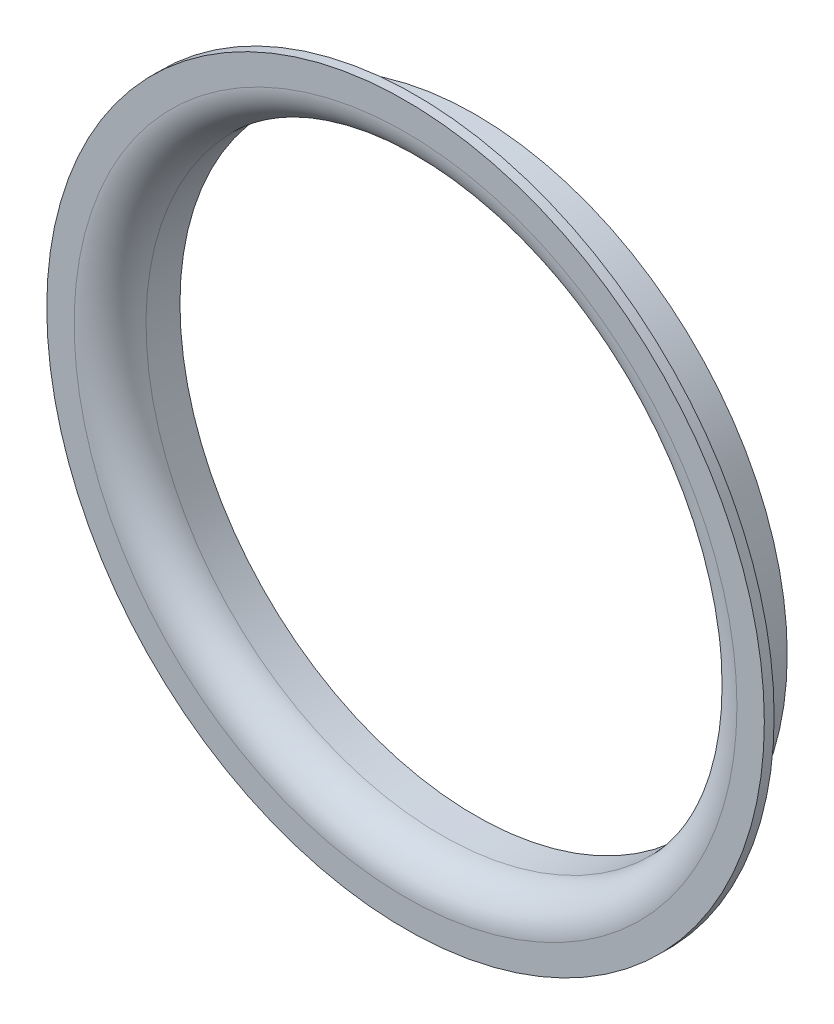
ISO-10303-21;
HEADER;
FILE_DESCRIPTION(('STEP AP214'),'2;1');
FILE_NAME('part.step','',(''),(''),'','','');
FILE_SCHEMA(('AUTOMOTIVE_DESIGN { 1 0 10303 214 1 1 1 1 }'));
ENDSEC;
DATA;
#1=APPLICATION_CONTEXT('core data for automotive mechanical design processes');
#2=APPLICATION_PROTOCOL_DEFINITION('international standard','automotive_design',2000,#1);
#3=PRODUCT_CONTEXT('',#1,'mechanical');
#4=PRODUCT('Part','Part','',(#3));
#5=PRODUCT_RELATED_PRODUCT_CATEGORY('part','',(#4));
#6=PRODUCT_DEFINITION_FORMATION('','',#4);
#7=PRODUCT_DEFINITION_CONTEXT('part definition',#1,'design');
#8=PRODUCT_DEFINITION('design','',#6,#7);
#9=PRODUCT_DEFINITION_SHAPE('','',#8);
#10=(LENGTH_UNIT() NAMED_UNIT(*) SI_UNIT(.MILLI.,.METRE.));
#11=(NAMED_UNIT(*) PLANE_ANGLE_UNIT() SI_UNIT($,.RADIAN.));
#12=(NAMED_UNIT(*) SI_UNIT($,.STERADIAN.) SOLID_ANGLE_UNIT());
#13=UNCERTAINTY_MEASURE_WITH_UNIT(LENGTH_MEASURE(1.E-05),#10,'distance_accuracy_value','');
#14=(GEOMETRIC_REPRESENTATION_CONTEXT(3) GLOBAL_UNCERTAINTY_ASSIGNED_CONTEXT((#13)) GLOBAL_UNIT_ASSIGNED_CONTEXT((#10,
#11,#12)) REPRESENTATION_CONTEXT('',''));
#15=CARTESIAN_POINT('',(0.,0.,0.));
#16=DIRECTION('',(0.,0.,1.));
#17=DIRECTION('',(1.,0.,0.));
#18=AXIS2_PLACEMENT_3D('',#15,#16,#17);
#19=CARTESIAN_POINT('',(0.,0.,6.02878527214585));
#20=DIRECTION('',(0.,0.,-1.));
#21=DIRECTION('',(-1.,0.,0.));
#22=AXIS2_PLACEMENT_3D('',#19,#20,#21);
#23=TOROIDAL_SURFACE('',#22,38.7931937172775,2.29319371727749);
#24=CARTESIAN_POINT('',(0.,0.,8.32197898942334));
#25=DIRECTION('',(0.,0.,-1.));
#26=DIRECTION('',(1.,0.,0.));
#27=AXIS2_PLACEMENT_3D('',#24,#25,#26);
#28=CIRCLE('',#27,38.7931937172775);
#29=CARTESIAN_POINT('',(-38.7931937172775,0.,8.32197898942334));
#30=VERTEX_POINT('',#29);
#31=EDGE_CURVE('E12',#30,#30,#28,.T.);
#32=ORIENTED_EDGE('',*,*,#31,.T.);
#33=EDGE_LOOP('',(#32));
#34=FACE_BOUND('',#33,.T.);
#35=CARTESIAN_POINT('',(0.,0.,6.02878527214585));
#36=DIRECTION('',(0.,0.,1.));
#37=DIRECTION('',(1.,0.,0.));
#38=AXIS2_PLACEMENT_3D('',#35,#36,#37);
#39=CIRCLE('',#38,36.5);
#40=CARTESIAN_POINT('',(-36.5,0.,6.02878527214585));
#41=VERTEX_POINT('',#40);
#42=EDGE_CURVE('E54',#41,#41,#39,.T.);
#43=ORIENTED_EDGE('',*,*,#42,.T.);
#44=EDGE_LOOP('',(#43));
#45=FACE_BOUND('',#44,.T.);
#46=ADVANCED_FACE('F43',(#34,#45),#23,.F.);
#47=CARTESIAN_POINT('',(0.,0.,1.28951825643905));
#48=DIRECTION('',(0.,0.,-1.));
#49=DIRECTION('',(1.,0.,0.));
#50=AXIS2_PLACEMENT_3D('',#47,#48,#49);
#51=CYLINDRICAL_SURFACE('',#50,36.5);
#52=CARTESIAN_POINT('',(0.,0.,1.28951825643905));
#53=DIRECTION('',(0.,0.,-1.));
#54=DIRECTION('',(1.,0.,0.));
#55=AXIS2_PLACEMENT_3D('',#52,#53,#54);
#56=CIRCLE('',#55,36.5);
#57=CARTESIAN_POINT('',(-36.5,0.,1.28951825643905));
#58=VERTEX_POINT('',#57);
#59=EDGE_CURVE('E70',#58,#58,#56,.T.);
#60=ORIENTED_EDGE('',*,*,#59,.F.);
#61=EDGE_LOOP('',(#60));
#62=FACE_BOUND('',#61,.T.);
#63=ORIENTED_EDGE('',*,*,#42,.F.);
#64=EDGE_LOOP('',(#63));
#65=FACE_BOUND('',#64,.T.);
#66=ADVANCED_FACE('F71',(#62,#65),#51,.T.);
#67=CARTESIAN_POINT('',(0.,0.,8.32197898942334));
#68=DIRECTION('',(0.,0.,1.));
#69=DIRECTION('',(1.,0.,0.));
#70=AXIS2_PLACEMENT_3D('',#67,#68,#69);
#71=PLANE('',#70);
#72=ORIENTED_EDGE('',*,*,#31,.F.);
#73=EDGE_LOOP('',(#72));
#74=FACE_BOUND('',#73,.T.);
#75=CARTESIAN_POINT('',(0.,0.,8.32197898942334));
#76=DIRECTION('',(0.,0.,1.));
#77=DIRECTION('',(1.,0.,0.));
#78=AXIS2_PLACEMENT_3D('',#75,#76,#77);
#79=CIRCLE('',#78,42.);
#80=CARTESIAN_POINT('',(42.,0.,8.32197898942334));
#81=VERTEX_POINT('',#80);
#82=EDGE_CURVE('E81',#81,#81,#79,.F.);
#83=ORIENTED_EDGE('',*,*,#82,.T.);
#84=EDGE_LOOP('',(#83));
#85=FACE_BOUND('',#84,.T.);
#86=ADVANCED_FACE('F45',(#74,#85),#71,.F.);
#87=CARTESIAN_POINT('',(0.,0.,5.26438736638669));
#88=DIRECTION('',(0.,0.,-1.));
#89=DIRECTION('',(-1.,0.,0.));
#90=AXIS2_PLACEMENT_3D('',#87,#88,#89);
#91=TOROIDAL_SURFACE('',#90,38.7931937172775,4.20418848167539);
#92=CARTESIAN_POINT('',(34.5890052356021,0.,5.26438736638669));
#93=CARTESIAN_POINT('',(34.5890172410576,-0.565961846233352,5.26438736638669));
#94=CARTESIAN_POINT('',(34.5751148834415,-1.13192267092011,5.26438736638669));
#95=CARTESIAN_POINT('',(34.5195676445111,-2.26248141749966,5.26438736638669));
#96=CARTESIAN_POINT('',(34.4779227631968,-2.82707933939246,5.26438736638669));
#97=CARTESIAN_POINT('',(34.3669766793149,-3.95355142068337,5.26438736638669));
#98=CARTESIAN_POINT('',(34.2976754767473,-4.51542558008149,5.26438736638669));
#99=CARTESIAN_POINT('',(34.1315874874656,-5.63509671823628,5.26438736638669));
#100=CARTESIAN_POINT('',(34.0348007007515,-6.19289369699296,5.26438736638669));
#101=CARTESIAN_POINT('',(33.8139736969861,-7.30306664226934,5.26438736638669));
#102=CARTESIAN_POINT('',(33.6899334799347,-7.85544260878905,5.26438736638669));
#103=CARTESIAN_POINT('',(33.4148987109528,-8.95344282085401,5.26438736638669));
#104=CARTESIAN_POINT('',(33.2639041590222,-9.49906706639925,5.26438736638669));
#105=CARTESIAN_POINT('',(32.9353244065783,-10.5822493763401,5.26438736638669));
#106=CARTESIAN_POINT('',(32.757739206065,-11.1198074407356,5.26438736638669));
#107=CARTESIAN_POINT('',(32.3764059942662,-12.1855623648738,5.26438736638669));
#108=CARTESIAN_POINT('',(32.1726579829808,-12.7137592246164,5.26438736638669));
#109=CARTESIAN_POINT('',(31.7394899912162,-13.7595192666921,5.26438736638669));
#110=CARTESIAN_POINT('',(31.510070010737,-14.2770824490253,5.26438736638669));
#111=CARTESIAN_POINT('',(31.0261107748131,-15.3003282813115,5.26438736638669));
#112=CARTESIAN_POINT('',(30.7715715193684,-15.8060109312645,5.26438736638669));
#113=CARTESIAN_POINT('',(30.2379869404997,-16.8042774649758,5.26438736638669));
#114=CARTESIAN_POINT('',(29.9589416170757,-17.2968613487341,5.26438736638669));
#115=CARTESIAN_POINT('',(29.3770171469745,-18.2677436723394,5.26438736638669));
#116=CARTESIAN_POINT('',(29.0741380002973,-18.7460421121866,5.26438736638669));
#117=CARTESIAN_POINT('',(28.4452755460562,-19.6872012851328,5.26438736638669));
#118=CARTESIAN_POINT('',(28.1192922384924,-20.1500620182319,5.26438736638669));
#119=CARTESIAN_POINT('',(27.4450067848258,-21.0592307056347,5.26438736638669));
#120=CARTESIAN_POINT('',(27.0967046387231,-21.5055386599383,5.26438736638669));
#121=CARTESIAN_POINT('',(26.3786205983546,-22.380526594796,5.26438736638669));
#122=CARTESIAN_POINT('',(26.0088387040888,-22.8092065753501,5.26438736638669));
#123=CARTESIAN_POINT('',(25.2486860043671,-23.6479058350879,5.26438736638669));
#124=CARTESIAN_POINT('',(24.858315198911,-24.0579251142714,5.26438736638669));
#125=CARTESIAN_POINT('',(24.0579251142714,-24.858315198911,5.26438736638669));
#126=CARTESIAN_POINT('',(23.6479058350879,-25.2486860043671,5.26438736638669));
#127=CARTESIAN_POINT('',(22.8092065753501,-26.0088387040888,5.26438736638669));
#128=CARTESIAN_POINT('',(22.380526594796,-26.3786205983545,5.26438736638669));
#129=CARTESIAN_POINT('',(21.5055386599383,-27.0967046387232,5.26438736638669));
#130=CARTESIAN_POINT('',(21.0592307056347,-27.4450067848262,5.26438736638669));
#131=CARTESIAN_POINT('',(20.1500620182319,-28.1192922384919,5.26438736638669));
#132=CARTESIAN_POINT('',(19.6872012851328,-28.4452755460546,5.26438736638669));
#133=CARTESIAN_POINT('',(18.7460421121867,-29.074138000299,5.26438736638669));
#134=CARTESIAN_POINT('',(18.2677436723397,-29.3770171469807,5.26438736638669));
#135=CARTESIAN_POINT('',(17.2968613487338,-29.9589416170696,5.26438736638669));
#136=CARTESIAN_POINT('',(16.8042774649747,-30.2379869404768,5.26438736638669));
#137=CARTESIAN_POINT('',(15.8060109312657,-30.7715715193913,5.26438736638669));
#138=CARTESIAN_POINT('',(15.3003282813157,-31.0261107748985,5.26438736638669));
#139=CARTESIAN_POINT('',(14.2770824490211,-31.5100700106515,5.26438736638669));
#140=CARTESIAN_POINT('',(13.7595192666765,-31.7394899908972,5.26438736638669));
#141=CARTESIAN_POINT('',(12.7137592246321,-32.1726579832998,5.26438736638669));
#142=CARTESIAN_POINT('',(12.1855623649323,-32.3764059954568,5.26438736638669));
#143=CARTESIAN_POINT('',(11.1198074406772,-32.7577392048744,5.26438736638669));
#144=CARTESIAN_POINT('',(10.5822493761218,-32.9353244021351,5.26438736638669));
#145=CARTESIAN_POINT('',(9.49906706661754,-33.2639041634653,5.26438736638669));
#146=CARTESIAN_POINT('',(8.95344282166865,-33.4148987275349,5.26438736638669));
#147=CARTESIAN_POINT('',(7.85544260797443,-33.6899334633526,5.26438736638669));
#148=CARTESIAN_POINT('',(7.30306663922911,-33.8139736351007,5.26438736638669));
#149=CARTESIAN_POINT('',(6.19289370003319,-34.034800762637,5.26438736638669));
#150=CARTESIAN_POINT('',(5.63509672958259,-34.1315877184252,5.26438736638669));
#151=CARTESIAN_POINT('',(4.51542556873516,-34.2976752457877,5.26438736638669));
#152=CARTESIAN_POINT('',(3.95355137833834,-34.366975817362,5.26438736638669));
#153=CARTESIAN_POINT('',(2.82707938173749,-34.4779236251497,5.26438736638669));
#154=CARTESIAN_POINT('',(2.26248157553346,-34.5195708613632,5.26438736638669));
#155=CARTESIAN_POINT('',(1.1319225128863,-34.5751116665894,5.26438736638669));
#156=CARTESIAN_POINT('',(0.565961256443151,-34.5890052356021,5.26438736638669));
#157=CARTESIAN_POINT('',(-0.56596125644314,-34.5890052356021,5.26438736638669));
#158=CARTESIAN_POINT('',(-1.13192251288629,-34.5751116665894,5.26438736638669));
#159=CARTESIAN_POINT('',(-2.26248157553345,-34.5195708613632,5.26438736638669));
#160=CARTESIAN_POINT('',(-2.82707938173748,-34.4779236251497,5.26438736638669));
#161=CARTESIAN_POINT('',(-3.95355137833832,-34.366975817362,5.26438736638669));
#162=CARTESIAN_POINT('',(-4.51542556873515,-34.2976752457877,5.26438736638669));
#163=CARTESIAN_POINT('',(-5.63509672958258,-34.1315877184252,5.26438736638669));
#164=CARTESIAN_POINT('',(-6.19289370003318,-34.034800762637,5.26438736638669));
#165=CARTESIAN_POINT('',(-7.3030666392291,-33.8139736351007,5.26438736638669));
#166=CARTESIAN_POINT('',(-7.85544260797442,-33.6899334633526,5.26438736638669));
#167=CARTESIAN_POINT('',(-8.95344282166863,-33.4148987275349,5.26438736638669));
#168=CARTESIAN_POINT('',(-9.49906706661753,-33.2639041634653,5.26438736638669));
#169=CARTESIAN_POINT('',(-10.5822493761218,-32.9353244021351,5.26438736638669));
#170=CARTESIAN_POINT('',(-11.1198074406772,-32.7577392048744,5.26438736638669));
#171=CARTESIAN_POINT('',(-12.1855623649323,-32.3764059954568,5.26438736638669));
#172=CARTESIAN_POINT('',(-12.7137592246321,-32.1726579832998,5.26438736638669));
#173=CARTESIAN_POINT('',(-13.7595192666765,-31.7394899908972,5.26438736638669));
#174=CARTESIAN_POINT('',(-14.2770824490211,-31.5100700106515,5.26438736638669));
#175=CARTESIAN_POINT('',(-15.3003282813157,-31.0261107748986,5.26438736638669));
#176=CARTESIAN_POINT('',(-15.8060109312657,-30.7715715193913,5.26438736638669));
#177=CARTESIAN_POINT('',(-16.8042774649747,-30.2379869404768,5.26438736638669));
#178=CARTESIAN_POINT('',(-17.2968613487338,-29.9589416170696,5.26438736638669));
#179=CARTESIAN_POINT('',(-18.2677436723397,-29.3770171469807,5.26438736638669));
#180=CARTESIAN_POINT('',(-18.7460421121866,-29.074138000299,5.26438736638669));
#181=CARTESIAN_POINT('',(-19.6872012851327,-28.4452755460546,5.26438736638669));
#182=CARTESIAN_POINT('',(-20.1500620182319,-28.1192922384919,5.26438736638669));
#183=CARTESIAN_POINT('',(-21.0592307056347,-27.4450067848262,5.26438736638669));
#184=CARTESIAN_POINT('',(-21.5055386599383,-27.0967046387232,5.26438736638669));
#185=CARTESIAN_POINT('',(-22.380526594796,-26.3786205983545,5.26438736638669));
#186=CARTESIAN_POINT('',(-22.8092065753501,-26.0088387040888,5.26438736638669));
#187=CARTESIAN_POINT('',(-23.6479058350878,-25.2486860043671,5.26438736638669));
#188=CARTESIAN_POINT('',(-24.0579251142714,-24.8583151989111,5.26438736638669));
#189=CARTESIAN_POINT('',(-24.858315198911,-24.0579251142714,5.26438736638669));
#190=CARTESIAN_POINT('',(-25.2486860043671,-23.6479058350878,5.26438736638669));
#191=CARTESIAN_POINT('',(-26.0088387040888,-22.8092065753501,5.26438736638669));
#192=CARTESIAN_POINT('',(-26.3786205983545,-22.380526594796,5.26438736638669));
#193=CARTESIAN_POINT('',(-27.0967046387232,-21.5055386599383,5.26438736638669));
#194=CARTESIAN_POINT('',(-27.4450067848262,-21.0592307056347,5.26438736638669));
#195=CARTESIAN_POINT('',(-28.1192922384919,-20.1500620182319,5.26438736638669));
#196=CARTESIAN_POINT('',(-28.4452755460546,-19.6872012851327,5.26438736638669));
#197=CARTESIAN_POINT('',(-29.074138000299,-18.7460421121867,5.26438736638669));
#198=CARTESIAN_POINT('',(-29.3770171469807,-18.2677436723397,5.26438736638669));
#199=CARTESIAN_POINT('',(-29.9589416170696,-17.2968613487338,5.26438736638669));
#200=CARTESIAN_POINT('',(-30.2379869404768,-16.8042774649747,5.26438736638669));
#201=CARTESIAN_POINT('',(-30.7715715193913,-15.8060109312657,5.26438736638669));
#202=CARTESIAN_POINT('',(-31.0261107748985,-15.3003282813157,5.26438736638669));
#203=CARTESIAN_POINT('',(-31.5100700106515,-14.2770824490211,5.26438736638669));
#204=CARTESIAN_POINT('',(-31.7394899908972,-13.7595192666765,5.26438736638669));
#205=CARTESIAN_POINT('',(-32.1726579832998,-12.7137592246321,5.26438736638669));
#206=CARTESIAN_POINT('',(-32.3764059954568,-12.1855623649323,5.26438736638669));
#207=CARTESIAN_POINT('',(-32.7577392048744,-11.1198074406772,5.26438736638669));
#208=CARTESIAN_POINT('',(-32.9353244021351,-10.5822493761218,5.26438736638669));
#209=CARTESIAN_POINT('',(-33.2639041634653,-9.49906706661755,5.26438736638669));
#210=CARTESIAN_POINT('',(-33.4148987275349,-8.95344282166864,5.26438736638669));
#211=CARTESIAN_POINT('',(-33.6899334633526,-7.85544260797441,5.26438736638669));
#212=CARTESIAN_POINT('',(-33.8139736351007,-7.3030666392291,5.26438736638669));
#213=CARTESIAN_POINT('',(-34.034800762637,-6.1928937000332,5.26438736638669));
#214=CARTESIAN_POINT('',(-34.1315877184252,-5.63509672958261,5.26438736638669));
#215=CARTESIAN_POINT('',(-34.2976752457877,-4.5154255687352,5.26438736638669));
#216=CARTESIAN_POINT('',(-34.366975817362,-3.95355137833837,5.26438736638669));
#217=CARTESIAN_POINT('',(-34.4779236251497,-2.82707938173751,5.26438736638669));
#218=CARTESIAN_POINT('',(-34.5195708613632,-2.26248157553348,5.26438736638669));
#219=CARTESIAN_POINT('',(-34.5751116665894,-1.1319225128863,5.26438736638669));
#220=CARTESIAN_POINT('',(-34.5890052356021,-0.565961256443154,5.26438736638669));
#221=CARTESIAN_POINT('',(-34.5890052356021,0.565961256443137,5.26438736638669));
#222=CARTESIAN_POINT('',(-34.5751116665894,1.13192251288628,5.26438736638669));
#223=CARTESIAN_POINT('',(-34.5195708613632,2.26248157553346,5.26438736638669));
#224=CARTESIAN_POINT('',(-34.4779236251497,2.82707938173749,5.26438736638669));
#225=CARTESIAN_POINT('',(-34.366975817362,3.95355137833835,5.26438736638669));
#226=CARTESIAN_POINT('',(-34.2976752457877,4.51542556873518,5.26438736638669));
#227=CARTESIAN_POINT('',(-34.1315877184252,5.6350967295826,5.26438736638669));
#228=CARTESIAN_POINT('',(-34.034800762637,6.19289370003318,5.26438736638669));
#229=CARTESIAN_POINT('',(-33.8139736351007,7.30306663922908,5.26438736638669));
#230=CARTESIAN_POINT('',(-33.6899334633526,7.8554426079744,5.26438736638669));
#231=CARTESIAN_POINT('',(-33.4148987275349,8.95344282166862,5.26438736638669));
#232=CARTESIAN_POINT('',(-33.2639041634653,9.49906706661754,5.26438736638669));
#233=CARTESIAN_POINT('',(-32.9353244021351,10.5822493761218,5.26438736638669));
#234=CARTESIAN_POINT('',(-32.7577392048744,11.1198074406771,5.26438736638669));
#235=CARTESIAN_POINT('',(-32.3764059954568,12.1855623649323,5.26438736638669));
#236=CARTESIAN_POINT('',(-32.1726579832998,12.7137592246321,5.26438736638669));
#237=CARTESIAN_POINT('',(-31.7394899908972,13.7595192666765,5.26438736638669));
#238=CARTESIAN_POINT('',(-31.5100700106515,14.2770824490211,5.26438736638669));
#239=CARTESIAN_POINT('',(-31.0261107748985,15.3003282813157,5.26438736638669));
#240=CARTESIAN_POINT('',(-30.7715715193913,15.8060109312657,5.26438736638669));
#241=CARTESIAN_POINT('',(-30.2379869404768,16.8042774649747,5.26438736638669));
#242=CARTESIAN_POINT('',(-29.9589416170696,17.2968613487338,5.26438736638669));
#243=CARTESIAN_POINT('',(-29.3770171469807,18.2677436723397,5.26438736638669));
#244=CARTESIAN_POINT('',(-29.074138000299,18.7460421121866,5.26438736638669));
#245=CARTESIAN_POINT('',(-28.4452755460546,19.6872012851327,5.26438736638669));
#246=CARTESIAN_POINT('',(-28.1192922384919,20.1500620182319,5.26438736638669));
#247=CARTESIAN_POINT('',(-27.4450067848262,21.0592307056347,5.26438736638669));
#248=CARTESIAN_POINT('',(-27.0967046387232,21.5055386599383,5.26438736638669));
#249=CARTESIAN_POINT('',(-26.3786205983545,22.380526594796,5.26438736638669));
#250=CARTESIAN_POINT('',(-26.0088387040888,22.8092065753501,5.26438736638669));
#251=CARTESIAN_POINT('',(-25.2486860043671,23.6479058350878,5.26438736638669));
#252=CARTESIAN_POINT('',(-24.8583151989111,24.0579251142714,5.26438736638669));
#253=CARTESIAN_POINT('',(-24.0579251142714,24.858315198911,5.26438736638669));
#254=CARTESIAN_POINT('',(-23.6479058350879,25.2486860043671,5.26438736638669));
#255=CARTESIAN_POINT('',(-22.8092065753501,26.0088387040888,5.26438736638669));
#256=CARTESIAN_POINT('',(-22.380526594796,26.3786205983545,5.26438736638669));
#257=CARTESIAN_POINT('',(-21.5055386599383,27.0967046387232,5.26438736638669));
#258=CARTESIAN_POINT('',(-21.0592307056347,27.4450067848262,5.26438736638669));
#259=CARTESIAN_POINT('',(-20.1500620182319,28.1192922384919,5.26438736638669));
#260=CARTESIAN_POINT('',(-19.6872012851328,28.4452755460546,5.26438736638669));
#261=CARTESIAN_POINT('',(-18.7460421121867,29.074138000299,5.26438736638669));
#262=CARTESIAN_POINT('',(-18.2677436723397,29.3770171469807,5.26438736638669));
#263=CARTESIAN_POINT('',(-17.2968613487338,29.9589416170696,5.26438736638669));
#264=CARTESIAN_POINT('',(-16.8042774649747,30.2379869404768,5.26438736638669));
#265=CARTESIAN_POINT('',(-15.8060109312657,30.7715715193913,5.26438736638669));
#266=CARTESIAN_POINT('',(-15.3003282813157,31.0261107748985,5.26438736638669));
#267=CARTESIAN_POINT('',(-14.2770824490211,31.5100700106515,5.26438736638669));
#268=CARTESIAN_POINT('',(-13.7595192666765,31.7394899908972,5.26438736638669));
#269=CARTESIAN_POINT('',(-12.7137592246321,32.1726579832998,5.26438736638669));
#270=CARTESIAN_POINT('',(-12.1855623649323,32.3764059954568,5.26438736638669));
#271=CARTESIAN_POINT('',(-11.1198074406772,32.7577392048744,5.26438736638669));
#272=CARTESIAN_POINT('',(-10.5822493761218,32.9353244021351,5.26438736638669));
#273=CARTESIAN_POINT('',(-9.49906706661755,33.2639041634653,5.26438736638669));
#274=CARTESIAN_POINT('',(-8.95344282166864,33.4148987275349,5.26438736638669));
#275=CARTESIAN_POINT('',(-7.85544260797442,33.6899334633526,5.26438736638669));
#276=CARTESIAN_POINT('',(-7.30306663922912,33.8139736351007,5.26438736638669));
#277=CARTESIAN_POINT('',(-6.19289370003322,34.0348007626369,5.26438736638669));
#278=CARTESIAN_POINT('',(-5.63509672958263,34.1315877184252,5.26438736638669));
#279=CARTESIAN_POINT('',(-4.5154255687352,34.2976752457877,5.26438736638669));
#280=CARTESIAN_POINT('',(-3.95355137833837,34.366975817362,5.26438736638669));
#281=CARTESIAN_POINT('',(-2.82707938173751,34.4779236251497,5.26438736638669));
#282=CARTESIAN_POINT('',(-2.26248157553348,34.5195708613632,5.26438736638669));
#283=CARTESIAN_POINT('',(-1.1319225128863,34.5751116665894,5.26438736638669));
#284=CARTESIAN_POINT('',(-0.565961256443157,34.5890052356021,5.26438736638669));
#285=CARTESIAN_POINT('',(0.565961256443134,34.5890052356021,5.26438736638669));
#286=CARTESIAN_POINT('',(1.13192251288628,34.5751116665894,5.26438736638669));
#287=CARTESIAN_POINT('',(2.26248157553346,34.5195708613632,5.26438736638669));
#288=CARTESIAN_POINT('',(2.82707938173749,34.4779236251497,5.26438736638669));
#289=CARTESIAN_POINT('',(3.95355137833834,34.366975817362,5.26438736638669));
#290=CARTESIAN_POINT('',(4.51542556873516,34.2976752457877,5.26438736638669));
#291=CARTESIAN_POINT('',(5.63509672958257,34.1315877184252,5.26438736638669));
#292=CARTESIAN_POINT('',(6.19289370003317,34.034800762637,5.26438736638669));
#293=CARTESIAN_POINT('',(7.30306663922908,33.8139736351007,5.26438736638669));
#294=CARTESIAN_POINT('',(7.85544260797439,33.6899334633526,5.26438736638669));
#295=CARTESIAN_POINT('',(8.95344282166862,33.4148987275349,5.26438736638669));
#296=CARTESIAN_POINT('',(9.49906706661753,33.2639041634653,5.26438736638669));
#297=CARTESIAN_POINT('',(10.5822493761218,32.9353244021351,5.26438736638669));
#298=CARTESIAN_POINT('',(11.1198074406772,32.7577392048744,5.26438736638669));
#299=CARTESIAN_POINT('',(12.1855623649323,32.3764059954568,5.26438736638669));
#300=CARTESIAN_POINT('',(12.7137592246321,32.1726579832998,5.26438736638669));
#301=CARTESIAN_POINT('',(13.7595192666765,31.7394899908972,5.26438736638669));
#302=CARTESIAN_POINT('',(14.2770824490211,31.5100700106515,5.26438736638669));
#303=CARTESIAN_POINT('',(15.3003282813157,31.0261107748986,5.26438736638669));
#304=CARTESIAN_POINT('',(15.8060109312656,30.7715715193913,5.26438736638669));
#305=CARTESIAN_POINT('',(16.8042774649747,30.2379869404768,5.26438736638669));
#306=CARTESIAN_POINT('',(17.2968613487338,29.9589416170696,5.26438736638669));
#307=CARTESIAN_POINT('',(18.2677436723397,29.3770171469807,5.26438736638669));
#308=CARTESIAN_POINT('',(18.7460421121866,29.074138000299,5.26438736638669));
#309=CARTESIAN_POINT('',(19.6872012851327,28.4452755460546,5.26438736638669));
#310=CARTESIAN_POINT('',(20.1500620182319,28.1192922384919,5.26438736638669));
#311=CARTESIAN_POINT('',(21.0592307056347,27.4450067848262,5.26438736638669));
#312=CARTESIAN_POINT('',(21.5055386599383,27.0967046387232,5.26438736638669));
#313=CARTESIAN_POINT('',(22.380526594796,26.3786205983545,5.26438736638669));
#314=CARTESIAN_POINT('',(22.8092065753501,26.0088387040888,5.26438736638669));
#315=CARTESIAN_POINT('',(23.6479058350878,25.2486860043671,5.26438736638669));
#316=CARTESIAN_POINT('',(24.0579251142714,24.858315198911,5.26438736638669));
#317=CARTESIAN_POINT('',(24.858315198911,24.0579251142714,5.26438736638669));
#318=CARTESIAN_POINT('',(25.248686004367,23.6479058350879,5.26438736638669));
#319=CARTESIAN_POINT('',(26.0088387040888,22.8092065753502,5.26438736638669));
#320=CARTESIAN_POINT('',(26.3786205983546,22.380526594796,5.26438736638669));
#321=CARTESIAN_POINT('',(27.0967046387231,21.5055386599383,5.26438736638669));
#322=CARTESIAN_POINT('',(27.4450067848258,21.0592307056347,5.26438736638669));
#323=CARTESIAN_POINT('',(28.1192922384924,20.1500620182319,5.26438736638669));
#324=CARTESIAN_POINT('',(28.4452755460562,19.6872012851328,5.26438736638669));
#325=CARTESIAN_POINT('',(29.0741380002973,18.7460421121866,5.26438736638669));
#326=CARTESIAN_POINT('',(29.3770171469745,18.2677436723394,5.26438736638669));
#327=CARTESIAN_POINT('',(29.9589416170757,17.2968613487341,5.26438736638669));
#328=CARTESIAN_POINT('',(30.2379869404997,16.8042774649758,5.26438736638669));
#329=CARTESIAN_POINT('',(30.7715715193684,15.8060109312645,5.26438736638669));
#330=CARTESIAN_POINT('',(31.0261107748131,15.3003282813115,5.26438736638669));
#331=CARTESIAN_POINT('',(31.510070010737,14.2770824490253,5.26438736638669));
#332=CARTESIAN_POINT('',(31.7394899912162,13.7595192666922,5.26438736638669));
#333=CARTESIAN_POINT('',(32.1726579829808,12.7137592246164,5.26438736638669));
#334=CARTESIAN_POINT('',(32.3764059942662,12.1855623648738,5.26438736638669));
#335=CARTESIAN_POINT('',(32.7577392060649,11.1198074407356,5.26438736638669));
#336=CARTESIAN_POINT('',(32.9353244065782,10.5822493763401,5.26438736638669));
#337=CARTESIAN_POINT('',(33.2639041590222,9.49906706639928,5.26438736638669));
#338=CARTESIAN_POINT('',(33.4148987109528,8.95344282085401,5.26438736638669));
#339=CARTESIAN_POINT('',(33.6899334799347,7.85544260878907,5.26438736638669));
#340=CARTESIAN_POINT('',(33.8139736969861,7.30306664226938,5.26438736638669));
#341=CARTESIAN_POINT('',(34.0348007007515,6.192893696993,5.26438736638669));
#342=CARTESIAN_POINT('',(34.1315874874656,5.6350967182363,5.26438736638669));
#343=CARTESIAN_POINT('',(34.2976754767473,4.51542558008149,5.26438736638669));
#344=CARTESIAN_POINT('',(34.3669766793149,3.95355142068337,5.26438736638669));
#345=CARTESIAN_POINT('',(34.4779227631968,2.82707933939246,5.26438736638669));
#346=CARTESIAN_POINT('',(34.5195676445111,2.26248141749966,5.26438736638669));
#347=CARTESIAN_POINT('',(34.5751148834415,1.13192267092011,5.26438736638669));
#348=CARTESIAN_POINT('',(34.5890172410576,0.565961846233366,5.26438736638669));
#349=CARTESIAN_POINT('',(34.5890052356021,0.,5.26438736638669));
#350=B_SPLINE_CURVE_WITH_KNOTS('',3,(#92,#93,#94,#95,#96,#97,#98,#99,#100,#101,#102,#103,#104,
#105,#106,#107,#108,#109,#110,#111,#112,#113,#114,#115,#116,#117,#118,#119,#120,#121,#122,#123,
#124,#125,#126,#127,#128,#129,#130,#131,#132,#133,#134,#135,#136,#137,#138,#139,#140,#141,#142,
#143,#144,#145,#146,#147,#148,#149,#150,#151,#152,#153,#154,#155,#156,#157,#158,#159,#160,#161,
#162,#163,#164,#165,#166,#167,#168,#169,#170,#171,#172,#173,#174,#175,#176,#177,#178,#179,#180,
#181,#182,#183,#184,#185,#186,#187,#188,#189,#190,#191,#192,#193,#194,#195,#196,#197,#198,#199,
#200,#201,#202,#203,#204,#205,#206,#207,#208,#209,#210,#211,#212,#213,#214,#215,#216,#217,#218,
#219,#220,#221,#222,#223,#224,#225,#226,#227,#228,#229,#230,#231,#232,#233,#234,#235,#236,#237,
#238,#239,#240,#241,#242,#243,#244,#245,#246,#247,#248,#249,#250,#251,#252,#253,#254,#255,#256,
#257,#258,#259,#260,#261,#262,#263,#264,#265,#266,#267,#268,#269,#270,#271,#272,#273,#274,#275,
#276,#277,#278,#279,#280,#281,#282,#283,#284,#285,#286,#287,#288,#289,#290,#291,#292,#293,#294,
#295,#296,#297,#298,#299,#300,#301,#302,#303,#304,#305,#306,#307,#308,#309,#310,#311,#312,#313,
#314,#315,#316,#317,#318,#319,#320,#321,#322,#323,#324,#325,#326,#327,#328,#329,#330,#331,#332,
#333,#334,#335,#336,#337,#338,#339,#340,#341,#342,#343,#344,#345,#346,#347,#348,#349),
.UNSPECIFIED.,.F.,.F.,(4,2,2,2,2,2,2,2,2,2,2,2,2,2,2,2,2,2,2,2,2,2,2,2,2,2,2,2,2,2,2,2,2,2,2,2,
2,2,2,2,2,2,2,2,2,2,2,2,2,2,2,2,2,2,2,2,2,2,2,2,2,2,2,2,2,2,2,2,2,2,2,2,2,2,2,2,2,2,2,2,2,2,2,2,
2,2,2,2,2,2,2,2,2,2,2,2,2,2,2,2,2,2,2,2,2,2,2,2,2,2,2,2,2,2,2,2,2,2,2,2,2,2,2,2,2,2,2,2,4),(0.,
1.69771336373425,3.39542672746849,5.09314009120272,6.79085345493696,8.48856681867121,
10.1862801824054,11.8839935461397,13.5817069098739,15.2794202736082,16.9771336373424,
18.6748470010767,20.3725603648109,22.0702737285451,23.7679870922794,25.4657004560136,
27.1634138197479,28.8611271834821,30.5588405472164,32.2565539109506,33.9542672746848,
35.6519806384191,37.3496940021533,39.0474073658876,40.7451207296218,42.442834093356,
44.1405474570903,45.8382608208245,47.5359741845588,49.233687548293,50.9314009120273,
52.6291142757615,54.3268276394957,56.02454100323,57.7222543669642,59.4199677306984,
61.1176810944327,62.8153944581669,64.5131078219012,66.2108211856354,67.9085345493696,
69.6062479131039,71.3039612768382,73.0016746405724,74.6993880043066,76.3971013680409,
78.0948147317751,79.7925280955093,81.4902414592436,83.1879548229779,84.8856681867121,
86.5833815504463,88.2810949141806,89.9788082779148,91.676521641649,93.3742350053833,
95.0719483691176,96.7696617328518,98.467375096586,100.16508846032,101.862801824055,
103.560515187789,105.258228551523,106.955941915257,108.653655278991,110.351368642726,
112.04908200646,113.746795370194,115.444508733928,117.142222097663,118.839935461397,
120.537648825131,122.235362188865,123.9330755526,125.630788916334,127.328502280068,
129.026215643802,130.723929007537,132.421642371271,134.119355735005,135.817069098739,
137.514782462474,139.212495826208,140.910209189942,142.607922553676,144.30563591741,
146.003349281145,147.701062644879,149.398776008613,151.096489372347,152.794202736082,
154.491916099816,156.18962946355,157.887342827284,159.585056191019,161.282769554753,
162.980482918487,164.678196282221,166.375909645956,168.07362300969,169.771336373424,
171.469049737158,173.166763100893,174.864476464627,176.562189828361,178.259903192095,
179.957616555829,181.655329919564,183.353043283298,185.050756647032,186.748470010766,
188.446183374501,190.143896738235,191.841610101969,193.539323465703,195.237036829438,
196.934750193172,198.632463556906,200.33017692064,202.027890284375,203.725603648109,
205.423317011843,207.121030375577,208.818743739312,210.516457103046,212.21417046678,
213.911883830514,215.609597194248,217.307310557983),.UNSPECIFIED.);
#351=CARTESIAN_POINT('',(34.5890052356021,0.,5.26438736638669));
#352=VERTEX_POINT('',#351);
#353=EDGE_CURVE('E78',#352,#352,#350,.T.);
#354=ORIENTED_EDGE('',*,*,#353,.T.);
#355=EDGE_LOOP('',(#354));
#356=FACE_BOUND('',#355,.T.);
#357=CARTESIAN_POINT('',(0.,0.,9.46857584806208));
#358=DIRECTION('',(0.,0.,1.));
#359=DIRECTION('',(-1.,0.,0.));
#360=AXIS2_PLACEMENT_3D('',#357,#358,#359);
#361=CIRCLE('',#360,38.7931937172775);
#362=CARTESIAN_POINT('',(38.7931937172775,0.,9.46857584806208));
#363=VERTEX_POINT('',#362);
#364=EDGE_CURVE('E74',#363,#363,#361,.T.);
#365=ORIENTED_EDGE('',*,*,#364,.T.);
#366=EDGE_LOOP('',(#365));
#367=FACE_BOUND('',#366,.T.);
#368=ADVANCED_FACE('F92',(#356,#367),#91,.T.);
#369=CARTESIAN_POINT('',(0.,0.,9.46857584806208));
#370=DIRECTION('',(0.,0.,1.));
#371=DIRECTION('',(-1.,0.,0.));
#372=AXIS2_PLACEMENT_3D('',#369,#370,#371);
#373=CYLINDRICAL_SURFACE('',#372,34.5890052356021);
#374=ORIENTED_EDGE('',*,*,#353,.F.);
#375=EDGE_LOOP('',(#374));
#376=FACE_BOUND('',#375,.T.);
#377=CARTESIAN_POINT('',(0.,0.,1.28951825643905));
#378=DIRECTION('',(0.,0.,1.));
#379=DIRECTION('',(1.,0.,0.));
#380=AXIS2_PLACEMENT_3D('',#377,#378,#379);
#381=CIRCLE('',#380,34.5890052356021);
#382=CARTESIAN_POINT('',(34.5890052356021,0.,1.28951825643905));
#383=VERTEX_POINT('',#382);
#384=EDGE_CURVE('E75',#383,#383,#381,.T.);
#385=ORIENTED_EDGE('',*,*,#384,.F.);
#386=EDGE_LOOP('',(#385));
#387=FACE_BOUND('',#386,.T.);
#388=ADVANCED_FACE('F102',(#376,#387),#373,.F.);
#389=CARTESIAN_POINT('',(0.,0.,9.46857584806208));
#390=DIRECTION('',(0.,0.,1.));
#391=DIRECTION('',(1.,0.,0.));
#392=AXIS2_PLACEMENT_3D('',#389,#390,#391);
#393=PLANE('',#392);
#394=ORIENTED_EDGE('',*,*,#364,.F.);
#395=EDGE_LOOP('',(#394));
#396=FACE_BOUND('',#395,.T.);
#397=CARTESIAN_POINT('',(0.,0.,9.46857584806208));
#398=DIRECTION('',(0.,0.,1.));
#399=DIRECTION('',(1.,0.,0.));
#400=AXIS2_PLACEMENT_3D('',#397,#398,#399);
#401=CIRCLE('',#400,42.);
#402=CARTESIAN_POINT('',(42.,0.,9.46857584806208));
#403=VERTEX_POINT('',#402);
#404=EDGE_CURVE('E134',#403,#403,#401,.T.);
#405=ORIENTED_EDGE('',*,*,#404,.T.);
#406=EDGE_LOOP('',(#405));
#407=FACE_BOUND('',#406,.T.);
#408=ADVANCED_FACE('F108',(#396,#407),#393,.T.);
#409=CARTESIAN_POINT('',(0.,0.,1.28951825643905));
#410=DIRECTION('',(0.,0.,1.));
#411=DIRECTION('',(1.,0.,0.));
#412=AXIS2_PLACEMENT_3D('',#409,#410,#411);
#413=PLANE('',#412);
#414=ORIENTED_EDGE('',*,*,#59,.T.);
#415=EDGE_LOOP('',(#414));
#416=FACE_BOUND('',#415,.T.);
#417=ORIENTED_EDGE('',*,*,#384,.T.);
#418=EDGE_LOOP('',(#417));
#419=FACE_BOUND('',#418,.T.);
#420=ADVANCED_FACE('F104',(#416,#419),#413,.F.);
#421=CARTESIAN_POINT('',(0.,0.,-110.471960249917));
#422=DIRECTION('',(0.,0.,1.));
#423=DIRECTION('',(1.,0.,0.));
#424=AXIS2_PLACEMENT_3D('',#421,#422,#423);
#425=CYLINDRICAL_SURFACE('',#424,42.);
#426=ORIENTED_EDGE('',*,*,#82,.F.);
#427=EDGE_LOOP('',(#426));
#428=FACE_BOUND('',#427,.T.);
#429=ORIENTED_EDGE('',*,*,#404,.F.);
#430=EDGE_LOOP('',(#429));
#431=FACE_BOUND('',#430,.T.);
#432=ADVANCED_FACE('F107',(#428,#431),#425,.T.);
#433=CLOSED_SHELL('',(#46,#66,#86,#368,#388,#408,#420,#432));
#434=MANIFOLD_SOLID_BREP('B2',#433);
#435=ADVANCED_BREP_SHAPE_REPRESENTATION('',(#18,#434),#14);
#436=SHAPE_DEFINITION_REPRESENTATION(#9,#435);
ENDSEC;
END-ISO-10303-21;
